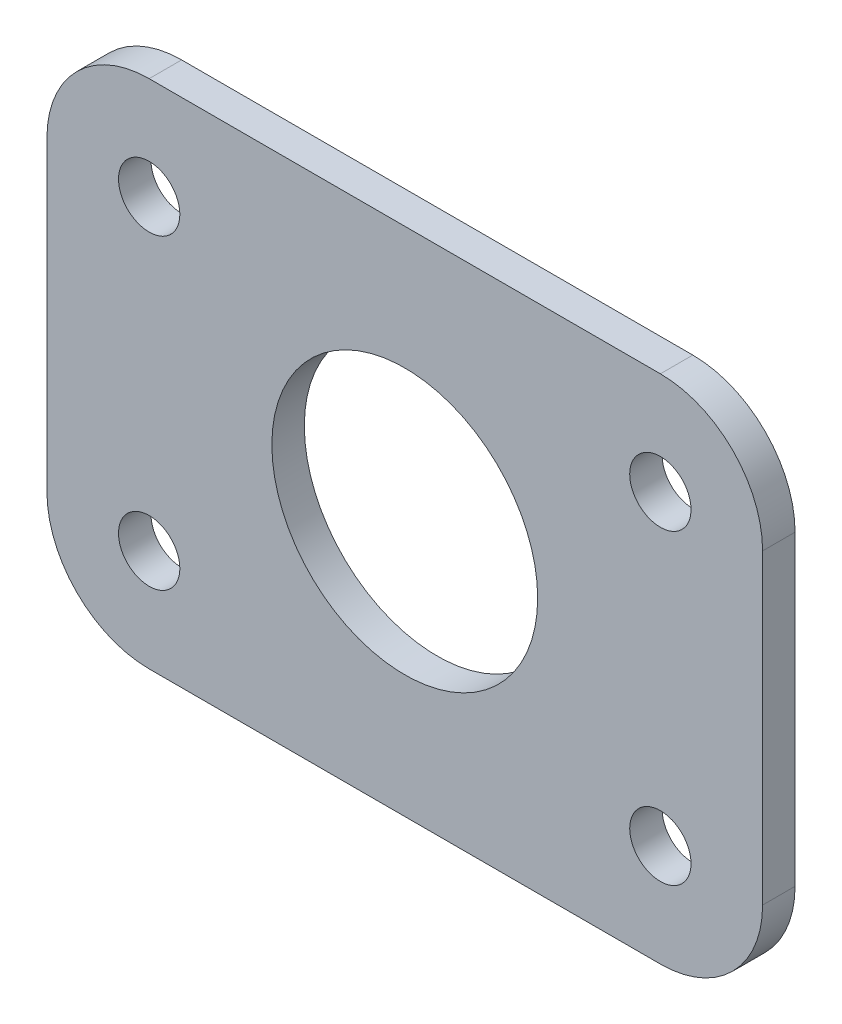
ISO-10303-21;
HEADER;
FILE_DESCRIPTION(('STEP AP214'),'2;1');
FILE_NAME('part.step','',(''),(''),'','','');
FILE_SCHEMA(('AUTOMOTIVE_DESIGN { 1 0 10303 214 1 1 1 1 }'));
ENDSEC;
DATA;
#1=APPLICATION_CONTEXT('core data for automotive mechanical design processes');
#2=APPLICATION_PROTOCOL_DEFINITION('international standard','automotive_design',2000,#1);
#3=PRODUCT_CONTEXT('',#1,'mechanical');
#4=PRODUCT('Part','Part','',(#3));
#5=PRODUCT_RELATED_PRODUCT_CATEGORY('part','',(#4));
#6=PRODUCT_DEFINITION_FORMATION('','',#4);
#7=PRODUCT_DEFINITION_CONTEXT('part definition',#1,'design');
#8=PRODUCT_DEFINITION('design','',#6,#7);
#9=PRODUCT_DEFINITION_SHAPE('','',#8);
#10=(LENGTH_UNIT() NAMED_UNIT(*) SI_UNIT(.MILLI.,.METRE.));
#11=(NAMED_UNIT(*) PLANE_ANGLE_UNIT() SI_UNIT($,.RADIAN.));
#12=(NAMED_UNIT(*) SI_UNIT($,.STERADIAN.) SOLID_ANGLE_UNIT());
#13=UNCERTAINTY_MEASURE_WITH_UNIT(LENGTH_MEASURE(1.E-05),#10,'distance_accuracy_value','');
#14=(GEOMETRIC_REPRESENTATION_CONTEXT(3) GLOBAL_UNCERTAINTY_ASSIGNED_CONTEXT((#13)) GLOBAL_UNIT_ASSIGNED_CONTEXT((#10,
#11,#12)) REPRESENTATION_CONTEXT('',''));
#15=CARTESIAN_POINT('',(0.,0.,0.));
#16=DIRECTION('',(0.,0.,1.));
#17=DIRECTION('',(1.,0.,0.));
#18=AXIS2_PLACEMENT_3D('',#15,#16,#17);
#19=CARTESIAN_POINT('',(0.,0.,1.5875));
#20=DIRECTION('',(0.,0.,-1.));
#21=DIRECTION('',(-1.,0.,0.));
#22=AXIS2_PLACEMENT_3D('',#19,#20,#21);
#23=PLANE('',#22);
#24=DIRECTION('',(1.,0.,0.));
#25=VECTOR('',#24,1.);
#26=CARTESIAN_POINT('',(0.,0.,1.5875));
#27=LINE('',#26,#25);
#28=CARTESIAN_POINT('',(5.,0.,1.5875));
#29=VERTEX_POINT('',#28);
#30=CARTESIAN_POINT('',(30.,0.,1.5875));
#31=VERTEX_POINT('',#30);
#32=EDGE_CURVE('E136',#29,#31,#27,.T.);
#33=ORIENTED_EDGE('',*,*,#32,.T.);
#34=CARTESIAN_POINT('',(30.,5.00000000000001,1.5875));
#35=DIRECTION('',(0.,0.,-1.));
#36=DIRECTION('',(-1.,0.,0.));
#37=AXIS2_PLACEMENT_3D('',#34,#35,#36);
#38=CIRCLE('',#37,5.);
#39=CARTESIAN_POINT('',(35.,5.00000000000002,1.5875));
#40=VERTEX_POINT('',#39);
#41=EDGE_CURVE('E151',#31,#40,#38,.F.);
#42=ORIENTED_EDGE('',*,*,#41,.T.);
#43=DIRECTION('',(0.,1.,0.));
#44=VECTOR('',#43,1.);
#45=CARTESIAN_POINT('',(35.,25.,1.5875));
#46=LINE('',#45,#44);
#47=CARTESIAN_POINT('',(35.,20.,1.5875));
#48=VERTEX_POINT('',#47);
#49=EDGE_CURVE('E118',#40,#48,#46,.T.);
#50=ORIENTED_EDGE('',*,*,#49,.T.);
#51=CARTESIAN_POINT('',(30.,20.,1.5875));
#52=DIRECTION('',(0.,0.,-1.));
#53=DIRECTION('',(-1.,0.,0.));
#54=AXIS2_PLACEMENT_3D('',#51,#52,#53);
#55=CIRCLE('',#54,5.);
#56=CARTESIAN_POINT('',(30.,25.,1.5875));
#57=VERTEX_POINT('',#56);
#58=EDGE_CURVE('E149',#48,#57,#55,.F.);
#59=ORIENTED_EDGE('',*,*,#58,.T.);
#60=DIRECTION('',(-1.,0.,0.));
#61=VECTOR('',#60,1.);
#62=CARTESIAN_POINT('',(0.,25.,1.5875));
#63=LINE('',#62,#61);
#64=CARTESIAN_POINT('',(5.,25.,1.5875));
#65=VERTEX_POINT('',#64);
#66=EDGE_CURVE('E171',#57,#65,#63,.T.);
#67=ORIENTED_EDGE('',*,*,#66,.T.);
#68=CARTESIAN_POINT('',(5.,20.,1.5875));
#69=DIRECTION('',(0.,0.,-1.));
#70=DIRECTION('',(-1.,0.,0.));
#71=AXIS2_PLACEMENT_3D('',#68,#69,#70);
#72=CIRCLE('',#71,5.);
#73=CARTESIAN_POINT('',(0.,20.,1.5875));
#74=VERTEX_POINT('',#73);
#75=EDGE_CURVE('E53',#65,#74,#72,.F.);
#76=ORIENTED_EDGE('',*,*,#75,.T.);
#77=DIRECTION('',(0.,-1.,0.));
#78=VECTOR('',#77,1.);
#79=CARTESIAN_POINT('',(0.,0.,1.5875));
#80=LINE('',#79,#78);
#81=CARTESIAN_POINT('',(0.,5.,1.5875));
#82=VERTEX_POINT('',#81);
#83=EDGE_CURVE('E137',#74,#82,#80,.T.);
#84=ORIENTED_EDGE('',*,*,#83,.T.);
#85=CARTESIAN_POINT('',(5.,5.,1.5875));
#86=DIRECTION('',(0.,0.,-1.));
#87=DIRECTION('',(-1.,0.,0.));
#88=AXIS2_PLACEMENT_3D('',#85,#86,#87);
#89=CIRCLE('',#88,5.);
#90=EDGE_CURVE('E147',#82,#29,#89,.F.);
#91=ORIENTED_EDGE('',*,*,#90,.T.);
#92=EDGE_LOOP('',(#33,#42,#50,#59,#67,#76,#84,#91));
#93=FACE_BOUND('',#92,.T.);
#94=CARTESIAN_POINT('',(17.5,12.5,1.5875));
#95=DIRECTION('',(0.,0.,1.));
#96=DIRECTION('',(1.,0.,0.));
#97=AXIS2_PLACEMENT_3D('',#94,#95,#96);
#98=CIRCLE('',#97,6.5);
#99=CARTESIAN_POINT('',(24.,12.5,1.5875));
#100=VERTEX_POINT('',#99);
#101=EDGE_CURVE('E131',#100,#100,#98,.T.);
#102=ORIENTED_EDGE('',*,*,#101,.F.);
#103=EDGE_LOOP('',(#102));
#104=FACE_BOUND('',#103,.T.);
#105=CARTESIAN_POINT('',(5.,20.,1.5875));
#106=DIRECTION('',(0.,0.,1.));
#107=DIRECTION('',(1.,0.,0.));
#108=AXIS2_PLACEMENT_3D('',#105,#106,#107);
#109=CIRCLE('',#108,1.5);
#110=CARTESIAN_POINT('',(6.5,20.,1.5875));
#111=VERTEX_POINT('',#110);
#112=EDGE_CURVE('E186',#111,#111,#109,.T.);
#113=ORIENTED_EDGE('',*,*,#112,.F.);
#114=EDGE_LOOP('',(#113));
#115=FACE_BOUND('',#114,.T.);
#116=CARTESIAN_POINT('',(5.00000000000001,5.,1.5875));
#117=DIRECTION('',(0.,0.,1.));
#118=DIRECTION('',(1.,0.,0.));
#119=AXIS2_PLACEMENT_3D('',#116,#117,#118);
#120=CIRCLE('',#119,1.5);
#121=CARTESIAN_POINT('',(6.50000000000001,5.,1.5875));
#122=VERTEX_POINT('',#121);
#123=EDGE_CURVE('E190',#122,#122,#120,.T.);
#124=ORIENTED_EDGE('',*,*,#123,.F.);
#125=EDGE_LOOP('',(#124));
#126=FACE_BOUND('',#125,.T.);
#127=CARTESIAN_POINT('',(30.,5.,1.5875));
#128=DIRECTION('',(0.,0.,1.));
#129=DIRECTION('',(-1.,0.,0.));
#130=AXIS2_PLACEMENT_3D('',#127,#128,#129);
#131=CIRCLE('',#130,1.5);
#132=CARTESIAN_POINT('',(28.5,5.,1.5875));
#133=VERTEX_POINT('',#132);
#134=EDGE_CURVE('E194',#133,#133,#131,.T.);
#135=ORIENTED_EDGE('',*,*,#134,.F.);
#136=EDGE_LOOP('',(#135));
#137=FACE_BOUND('',#136,.T.);
#138=CARTESIAN_POINT('',(30.,20.,1.5875));
#139=DIRECTION('',(0.,0.,1.));
#140=DIRECTION('',(-1.,0.,0.));
#141=AXIS2_PLACEMENT_3D('',#138,#139,#140);
#142=CIRCLE('',#141,1.5);
#143=CARTESIAN_POINT('',(28.5,20.,1.5875));
#144=VERTEX_POINT('',#143);
#145=EDGE_CURVE('E197',#144,#144,#142,.T.);
#146=ORIENTED_EDGE('',*,*,#145,.F.);
#147=EDGE_LOOP('',(#146));
#148=FACE_BOUND('',#147,.T.);
#149=ADVANCED_FACE('F33',(#93,#104,#115,#126,#137,#148),#23,.F.);
#150=CARTESIAN_POINT('',(0.,0.,0.));
#151=DIRECTION('',(0.,0.,-1.));
#152=DIRECTION('',(-1.,0.,0.));
#153=AXIS2_PLACEMENT_3D('',#150,#151,#152);
#154=PLANE('',#153);
#155=CARTESIAN_POINT('',(30.,5.,0.));
#156=DIRECTION('',(0.,0.,1.));
#157=DIRECTION('',(-1.,0.,0.));
#158=AXIS2_PLACEMENT_3D('',#155,#156,#157);
#159=CIRCLE('',#158,1.5);
#160=CARTESIAN_POINT('',(28.5,5.,0.));
#161=VERTEX_POINT('',#160);
#162=EDGE_CURVE('E199',#161,#161,#159,.T.);
#163=ORIENTED_EDGE('',*,*,#162,.T.);
#164=EDGE_LOOP('',(#163));
#165=FACE_BOUND('',#164,.T.);
#166=CARTESIAN_POINT('',(5.,20.,0.));
#167=DIRECTION('',(0.,0.,1.));
#168=DIRECTION('',(1.,0.,0.));
#169=AXIS2_PLACEMENT_3D('',#166,#167,#168);
#170=CIRCLE('',#169,1.5);
#171=CARTESIAN_POINT('',(6.5,20.,0.));
#172=VERTEX_POINT('',#171);
#173=EDGE_CURVE('E210',#172,#172,#170,.T.);
#174=ORIENTED_EDGE('',*,*,#173,.T.);
#175=EDGE_LOOP('',(#174));
#176=FACE_BOUND('',#175,.T.);
#177=DIRECTION('',(0.,1.,0.));
#178=VECTOR('',#177,1.);
#179=CARTESIAN_POINT('',(35.,25.,0.));
#180=LINE('',#179,#178);
#181=CARTESIAN_POINT('',(35.,5.00000000000002,0.));
#182=VERTEX_POINT('',#181);
#183=CARTESIAN_POINT('',(35.,20.,0.));
#184=VERTEX_POINT('',#183);
#185=EDGE_CURVE('E115',#182,#184,#180,.T.);
#186=ORIENTED_EDGE('',*,*,#185,.F.);
#187=CARTESIAN_POINT('',(30.,5.00000000000001,0.));
#188=DIRECTION('',(0.,0.,-1.));
#189=DIRECTION('',(-1.,0.,0.));
#190=AXIS2_PLACEMENT_3D('',#187,#188,#189);
#191=CIRCLE('',#190,5.);
#192=CARTESIAN_POINT('',(30.,0.,0.));
#193=VERTEX_POINT('',#192);
#194=EDGE_CURVE('E98',#182,#193,#191,.T.);
#195=ORIENTED_EDGE('',*,*,#194,.T.);
#196=DIRECTION('',(1.,0.,0.));
#197=VECTOR('',#196,1.);
#198=CARTESIAN_POINT('',(0.,0.,0.));
#199=LINE('',#198,#197);
#200=CARTESIAN_POINT('',(5.,0.,0.));
#201=VERTEX_POINT('',#200);
#202=EDGE_CURVE('E126',#201,#193,#199,.T.);
#203=ORIENTED_EDGE('',*,*,#202,.F.);
#204=CARTESIAN_POINT('',(5.,5.,0.));
#205=DIRECTION('',(0.,0.,-1.));
#206=DIRECTION('',(-1.,0.,0.));
#207=AXIS2_PLACEMENT_3D('',#204,#205,#206);
#208=CIRCLE('',#207,5.);
#209=CARTESIAN_POINT('',(0.,5.,0.));
#210=VERTEX_POINT('',#209);
#211=EDGE_CURVE('E140',#201,#210,#208,.T.);
#212=ORIENTED_EDGE('',*,*,#211,.T.);
#213=DIRECTION('',(0.,-1.,0.));
#214=VECTOR('',#213,1.);
#215=CARTESIAN_POINT('',(0.,0.,0.));
#216=LINE('',#215,#214);
#217=CARTESIAN_POINT('',(0.,20.,0.));
#218=VERTEX_POINT('',#217);
#219=EDGE_CURVE('E129',#218,#210,#216,.T.);
#220=ORIENTED_EDGE('',*,*,#219,.F.);
#221=CARTESIAN_POINT('',(5.,20.,0.));
#222=DIRECTION('',(0.,0.,-1.));
#223=DIRECTION('',(-1.,0.,0.));
#224=AXIS2_PLACEMENT_3D('',#221,#222,#223);
#225=CIRCLE('',#224,5.);
#226=CARTESIAN_POINT('',(5.,25.,0.));
#227=VERTEX_POINT('',#226);
#228=EDGE_CURVE('E119',#218,#227,#225,.T.);
#229=ORIENTED_EDGE('',*,*,#228,.T.);
#230=DIRECTION('',(-1.,0.,0.));
#231=VECTOR('',#230,1.);
#232=CARTESIAN_POINT('',(0.,25.,0.));
#233=LINE('',#232,#231);
#234=CARTESIAN_POINT('',(30.,25.,0.));
#235=VERTEX_POINT('',#234);
#236=EDGE_CURVE('E125',#235,#227,#233,.T.);
#237=ORIENTED_EDGE('',*,*,#236,.F.);
#238=CARTESIAN_POINT('',(30.,20.,0.));
#239=DIRECTION('',(0.,0.,-1.));
#240=DIRECTION('',(-1.,0.,0.));
#241=AXIS2_PLACEMENT_3D('',#238,#239,#240);
#242=CIRCLE('',#241,5.);
#243=EDGE_CURVE('E109',#235,#184,#242,.T.);
#244=ORIENTED_EDGE('',*,*,#243,.T.);
#245=EDGE_LOOP('',(#186,#195,#203,#212,#220,#229,#237,#244));
#246=FACE_BOUND('',#245,.T.);
#247=CARTESIAN_POINT('',(17.5,12.5,0.));
#248=DIRECTION('',(0.,0.,1.));
#249=DIRECTION('',(1.,0.,0.));
#250=AXIS2_PLACEMENT_3D('',#247,#248,#249);
#251=CIRCLE('',#250,6.5);
#252=CARTESIAN_POINT('',(24.,12.5,0.));
#253=VERTEX_POINT('',#252);
#254=EDGE_CURVE('E174',#253,#253,#251,.T.);
#255=ORIENTED_EDGE('',*,*,#254,.T.);
#256=EDGE_LOOP('',(#255));
#257=FACE_BOUND('',#256,.T.);
#258=CARTESIAN_POINT('',(5.00000000000001,5.,0.));
#259=DIRECTION('',(0.,0.,1.));
#260=DIRECTION('',(1.,0.,0.));
#261=AXIS2_PLACEMENT_3D('',#258,#259,#260);
#262=CIRCLE('',#261,1.5);
#263=CARTESIAN_POINT('',(6.50000000000001,5.,0.));
#264=VERTEX_POINT('',#263);
#265=EDGE_CURVE('E207',#264,#264,#262,.T.);
#266=ORIENTED_EDGE('',*,*,#265,.T.);
#267=EDGE_LOOP('',(#266));
#268=FACE_BOUND('',#267,.T.);
#269=CARTESIAN_POINT('',(30.,20.,0.));
#270=DIRECTION('',(0.,0.,1.));
#271=DIRECTION('',(-1.,0.,0.));
#272=AXIS2_PLACEMENT_3D('',#269,#270,#271);
#273=CIRCLE('',#272,1.5);
#274=CARTESIAN_POINT('',(28.5,20.,0.));
#275=VERTEX_POINT('',#274);
#276=EDGE_CURVE('E200',#275,#275,#273,.T.);
#277=ORIENTED_EDGE('',*,*,#276,.T.);
#278=EDGE_LOOP('',(#277));
#279=FACE_BOUND('',#278,.T.);
#280=ADVANCED_FACE('F122',(#165,#176,#246,#257,#268,#279),#154,.T.);
#281=CARTESIAN_POINT('',(0.,0.,1.5875));
#282=DIRECTION('',(0.,1.,0.));
#283=DIRECTION('',(-1.,0.,0.));
#284=AXIS2_PLACEMENT_3D('',#281,#282,#283);
#285=PLANE('',#284);
#286=ORIENTED_EDGE('',*,*,#202,.T.);
#287=DIRECTION('',(0.,0.,-1.));
#288=VECTOR('',#287,1.);
#289=CARTESIAN_POINT('',(30.,0.,1.5875));
#290=LINE('',#289,#288);
#291=EDGE_CURVE('E103',#193,#31,#290,.F.);
#292=ORIENTED_EDGE('',*,*,#291,.T.);
#293=ORIENTED_EDGE('',*,*,#32,.F.);
#294=DIRECTION('',(0.,0.,-1.));
#295=VECTOR('',#294,1.);
#296=CARTESIAN_POINT('',(5.,0.,1.5875));
#297=LINE('',#296,#295);
#298=EDGE_CURVE('E108',#29,#201,#297,.T.);
#299=ORIENTED_EDGE('',*,*,#298,.T.);
#300=EDGE_LOOP('',(#286,#292,#293,#299));
#301=FACE_BOUND('',#300,.T.);
#302=ADVANCED_FACE('F168',(#301),#285,.F.);
#303=CARTESIAN_POINT('',(35.,25.,1.5875));
#304=DIRECTION('',(-1.,0.,0.));
#305=DIRECTION('',(0.,-1.,0.));
#306=AXIS2_PLACEMENT_3D('',#303,#304,#305);
#307=PLANE('',#306);
#308=ORIENTED_EDGE('',*,*,#49,.F.);
#309=DIRECTION('',(0.,0.,-1.));
#310=VECTOR('',#309,1.);
#311=CARTESIAN_POINT('',(35.,5.00000000000001,1.5875));
#312=LINE('',#311,#310);
#313=EDGE_CURVE('E102',#40,#182,#312,.T.);
#314=ORIENTED_EDGE('',*,*,#313,.T.);
#315=ORIENTED_EDGE('',*,*,#185,.T.);
#316=DIRECTION('',(0.,0.,-1.));
#317=VECTOR('',#316,1.);
#318=CARTESIAN_POINT('',(35.,20.,1.5875));
#319=LINE('',#318,#317);
#320=EDGE_CURVE('E120',#184,#48,#319,.F.);
#321=ORIENTED_EDGE('',*,*,#320,.T.);
#322=EDGE_LOOP('',(#308,#314,#315,#321));
#323=FACE_BOUND('',#322,.T.);
#324=ADVANCED_FACE('F114',(#323),#307,.F.);
#325=CARTESIAN_POINT('',(0.,25.,1.5875));
#326=DIRECTION('',(0.,-1.,0.));
#327=DIRECTION('',(1.,0.,0.));
#328=AXIS2_PLACEMENT_3D('',#325,#326,#327);
#329=PLANE('',#328);
#330=ORIENTED_EDGE('',*,*,#66,.F.);
#331=DIRECTION('',(0.,0.,-1.));
#332=VECTOR('',#331,1.);
#333=CARTESIAN_POINT('',(30.,25.,1.5875));
#334=LINE('',#333,#332);
#335=EDGE_CURVE('E155',#57,#235,#334,.T.);
#336=ORIENTED_EDGE('',*,*,#335,.T.);
#337=ORIENTED_EDGE('',*,*,#236,.T.);
#338=DIRECTION('',(0.,0.,-1.));
#339=VECTOR('',#338,1.);
#340=CARTESIAN_POINT('',(5.,25.,1.5875));
#341=LINE('',#340,#339);
#342=EDGE_CURVE('E153',#227,#65,#341,.F.);
#343=ORIENTED_EDGE('',*,*,#342,.T.);
#344=EDGE_LOOP('',(#330,#336,#337,#343));
#345=FACE_BOUND('',#344,.T.);
#346=ADVANCED_FACE('F231',(#345),#329,.F.);
#347=CARTESIAN_POINT('',(0.,0.,1.5875));
#348=DIRECTION('',(1.,0.,0.));
#349=DIRECTION('',(0.,0.,-1.));
#350=AXIS2_PLACEMENT_3D('',#347,#348,#349);
#351=PLANE('',#350);
#352=ORIENTED_EDGE('',*,*,#219,.T.);
#353=DIRECTION('',(0.,0.,-1.));
#354=VECTOR('',#353,1.);
#355=CARTESIAN_POINT('',(0.,5.,1.5875));
#356=LINE('',#355,#354);
#357=EDGE_CURVE('E11',#210,#82,#356,.F.);
#358=ORIENTED_EDGE('',*,*,#357,.T.);
#359=ORIENTED_EDGE('',*,*,#83,.F.);
#360=DIRECTION('',(0.,0.,-1.));
#361=VECTOR('',#360,1.);
#362=CARTESIAN_POINT('',(0.,20.,1.5875));
#363=LINE('',#362,#361);
#364=EDGE_CURVE('E41',#74,#218,#363,.T.);
#365=ORIENTED_EDGE('',*,*,#364,.T.);
#366=EDGE_LOOP('',(#352,#358,#359,#365));
#367=FACE_BOUND('',#366,.T.);
#368=ADVANCED_FACE('F160',(#367),#351,.F.);
#369=CARTESIAN_POINT('',(17.5,12.5,1.5875));
#370=DIRECTION('',(0.,0.,-1.));
#371=DIRECTION('',(-1.,0.,0.));
#372=AXIS2_PLACEMENT_3D('',#369,#370,#371);
#373=CYLINDRICAL_SURFACE('',#372,6.5);
#374=ORIENTED_EDGE('',*,*,#101,.T.);
#375=EDGE_LOOP('',(#374));
#376=FACE_BOUND('',#375,.T.);
#377=ORIENTED_EDGE('',*,*,#254,.F.);
#378=EDGE_LOOP('',(#377));
#379=FACE_BOUND('',#378,.T.);
#380=ADVANCED_FACE('F220',(#376,#379),#373,.F.);
#381=CARTESIAN_POINT('',(5.,20.,1.5875));
#382=DIRECTION('',(0.,0.,-1.));
#383=DIRECTION('',(-1.,0.,0.));
#384=AXIS2_PLACEMENT_3D('',#381,#382,#383);
#385=CYLINDRICAL_SURFACE('',#384,1.5);
#386=ORIENTED_EDGE('',*,*,#112,.T.);
#387=EDGE_LOOP('',(#386));
#388=FACE_BOUND('',#387,.T.);
#389=ORIENTED_EDGE('',*,*,#173,.F.);
#390=EDGE_LOOP('',(#389));
#391=FACE_BOUND('',#390,.T.);
#392=ADVANCED_FACE('F222',(#388,#391),#385,.F.);
#393=CARTESIAN_POINT('',(5.00000000000001,5.,1.5875));
#394=DIRECTION('',(0.,0.,-1.));
#395=DIRECTION('',(-1.,0.,0.));
#396=AXIS2_PLACEMENT_3D('',#393,#394,#395);
#397=CYLINDRICAL_SURFACE('',#396,1.5);
#398=ORIENTED_EDGE('',*,*,#123,.T.);
#399=EDGE_LOOP('',(#398));
#400=FACE_BOUND('',#399,.T.);
#401=ORIENTED_EDGE('',*,*,#265,.F.);
#402=EDGE_LOOP('',(#401));
#403=FACE_BOUND('',#402,.T.);
#404=ADVANCED_FACE('F228',(#400,#403),#397,.F.);
#405=CARTESIAN_POINT('',(30.,5.,1.5875));
#406=DIRECTION('',(0.,0.,-1.));
#407=DIRECTION('',(-1.,0.,0.));
#408=AXIS2_PLACEMENT_3D('',#405,#406,#407);
#409=CYLINDRICAL_SURFACE('',#408,1.5);
#410=ORIENTED_EDGE('',*,*,#134,.T.);
#411=EDGE_LOOP('',(#410));
#412=FACE_BOUND('',#411,.T.);
#413=ORIENTED_EDGE('',*,*,#162,.F.);
#414=EDGE_LOOP('',(#413));
#415=FACE_BOUND('',#414,.T.);
#416=ADVANCED_FACE('F323',(#412,#415),#409,.F.);
#417=CARTESIAN_POINT('',(30.,20.,1.5875));
#418=DIRECTION('',(0.,0.,-1.));
#419=DIRECTION('',(-1.,0.,0.));
#420=AXIS2_PLACEMENT_3D('',#417,#418,#419);
#421=CYLINDRICAL_SURFACE('',#420,1.5);
#422=ORIENTED_EDGE('',*,*,#145,.T.);
#423=EDGE_LOOP('',(#422));
#424=FACE_BOUND('',#423,.T.);
#425=ORIENTED_EDGE('',*,*,#276,.F.);
#426=EDGE_LOOP('',(#425));
#427=FACE_BOUND('',#426,.T.);
#428=ADVANCED_FACE('F248',(#424,#427),#421,.F.);
#429=CARTESIAN_POINT('',(30.,5.00000000000001,1.5875));
#430=DIRECTION('',(0.,0.,-1.));
#431=DIRECTION('',(-1.,0.,0.));
#432=AXIS2_PLACEMENT_3D('',#429,#430,#431);
#433=CYLINDRICAL_SURFACE('',#432,5.);
#434=ORIENTED_EDGE('',*,*,#41,.F.);
#435=ORIENTED_EDGE('',*,*,#291,.F.);
#436=ORIENTED_EDGE('',*,*,#194,.F.);
#437=ORIENTED_EDGE('',*,*,#313,.F.);
#438=EDGE_LOOP('',(#434,#435,#436,#437));
#439=FACE_BOUND('',#438,.T.);
#440=ADVANCED_FACE('F101',(#439),#433,.T.);
#441=CARTESIAN_POINT('',(30.,20.,1.5875));
#442=DIRECTION('',(0.,0.,-1.));
#443=DIRECTION('',(-1.,0.,0.));
#444=AXIS2_PLACEMENT_3D('',#441,#442,#443);
#445=CYLINDRICAL_SURFACE('',#444,5.);
#446=ORIENTED_EDGE('',*,*,#58,.F.);
#447=ORIENTED_EDGE('',*,*,#320,.F.);
#448=ORIENTED_EDGE('',*,*,#243,.F.);
#449=ORIENTED_EDGE('',*,*,#335,.F.);
#450=EDGE_LOOP('',(#446,#447,#448,#449));
#451=FACE_BOUND('',#450,.T.);
#452=ADVANCED_FACE('F247',(#451),#445,.T.);
#453=CARTESIAN_POINT('',(5.,5.,1.5875));
#454=DIRECTION('',(0.,0.,-1.));
#455=DIRECTION('',(-1.,0.,0.));
#456=AXIS2_PLACEMENT_3D('',#453,#454,#455);
#457=CYLINDRICAL_SURFACE('',#456,5.);
#458=ORIENTED_EDGE('',*,*,#90,.F.);
#459=ORIENTED_EDGE('',*,*,#357,.F.);
#460=ORIENTED_EDGE('',*,*,#211,.F.);
#461=ORIENTED_EDGE('',*,*,#298,.F.);
#462=EDGE_LOOP('',(#458,#459,#460,#461));
#463=FACE_BOUND('',#462,.T.);
#464=ADVANCED_FACE('F165',(#463),#457,.T.);
#465=CARTESIAN_POINT('',(5.,20.,1.5875));
#466=DIRECTION('',(0.,0.,-1.));
#467=DIRECTION('',(-1.,0.,0.));
#468=AXIS2_PLACEMENT_3D('',#465,#466,#467);
#469=CYLINDRICAL_SURFACE('',#468,5.);
#470=ORIENTED_EDGE('',*,*,#75,.F.);
#471=ORIENTED_EDGE('',*,*,#342,.F.);
#472=ORIENTED_EDGE('',*,*,#228,.F.);
#473=ORIENTED_EDGE('',*,*,#364,.F.);
#474=EDGE_LOOP('',(#470,#471,#472,#473));
#475=FACE_BOUND('',#474,.T.);
#476=ADVANCED_FACE('F35',(#475),#469,.T.);
#477=CLOSED_SHELL('',(#149,#280,#302,#324,#346,#368,#380,#392,#404,#416,#428,#440,#452,#464,#476));
#478=MANIFOLD_SOLID_BREP('B2',#477);
#479=ADVANCED_BREP_SHAPE_REPRESENTATION('',(#18,#478),#14);
#480=SHAPE_DEFINITION_REPRESENTATION(#9,#479);
ENDSEC;
END-ISO-10303-21;
